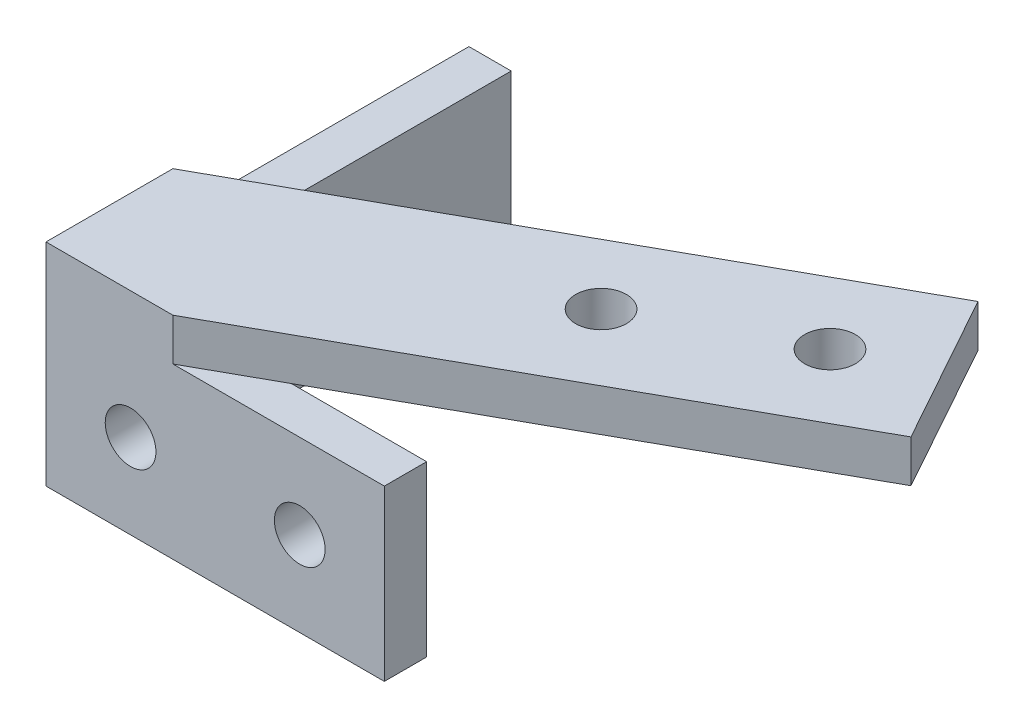
ISO-10303-21;
HEADER;
FILE_DESCRIPTION(('STEP AP214'),'2;1');
FILE_NAME('part.step','',(''),(''),'','','');
FILE_SCHEMA(('AUTOMOTIVE_DESIGN { 1 0 10303 214 1 1 1 1 }'));
ENDSEC;
DATA;
#1=APPLICATION_CONTEXT('core data for automotive mechanical design processes');
#2=APPLICATION_PROTOCOL_DEFINITION('international standard','automotive_design',2000,#1);
#3=PRODUCT_CONTEXT('',#1,'mechanical');
#4=PRODUCT('Part','Part','',(#3));
#5=PRODUCT_RELATED_PRODUCT_CATEGORY('part','',(#4));
#6=PRODUCT_DEFINITION_FORMATION('','',#4);
#7=PRODUCT_DEFINITION_CONTEXT('part definition',#1,'design');
#8=PRODUCT_DEFINITION('design','',#6,#7);
#9=PRODUCT_DEFINITION_SHAPE('','',#8);
#10=(LENGTH_UNIT() NAMED_UNIT(*) SI_UNIT(.MILLI.,.METRE.));
#11=(NAMED_UNIT(*) PLANE_ANGLE_UNIT() SI_UNIT($,.RADIAN.));
#12=(NAMED_UNIT(*) SI_UNIT($,.STERADIAN.) SOLID_ANGLE_UNIT());
#13=UNCERTAINTY_MEASURE_WITH_UNIT(LENGTH_MEASURE(1.E-05),#10,'distance_accuracy_value','');
#14=(GEOMETRIC_REPRESENTATION_CONTEXT(3) GLOBAL_UNCERTAINTY_ASSIGNED_CONTEXT((#13)) GLOBAL_UNIT_ASSIGNED_CONTEXT((#10,
#11,#12)) REPRESENTATION_CONTEXT('',''));
#15=CARTESIAN_POINT('',(0.,0.,0.));
#16=DIRECTION('',(0.,0.,1.));
#17=DIRECTION('',(1.,0.,0.));
#18=AXIS2_PLACEMENT_3D('',#15,#16,#17);
#19=CARTESIAN_POINT('',(0.,20.,0.));
#20=DIRECTION('',(0.,1.,0.));
#21=DIRECTION('',(0.,0.,1.));
#22=AXIS2_PLACEMENT_3D('',#19,#20,#21);
#23=PLANE('',#22);
#24=DIRECTION('',(-0.874157276113718,0.,0.485642931192707));
#25=VECTOR('',#24,1.);
#26=CARTESIAN_POINT('',(0.,20.,-15.));
#27=LINE('',#26,#25);
#28=CARTESIAN_POINT('',(5.,20.,-17.7777777778831));
#29=VERTEX_POINT('',#28);
#30=CARTESIAN_POINT('',(0.,20.,-15.));
#31=VERTEX_POINT('',#30);
#32=EDGE_CURVE('E11',#29,#31,#27,.T.);
#33=ORIENTED_EDGE('',*,*,#32,.F.);
#34=DIRECTION('',(0.,0.,-1.));
#35=VECTOR('',#34,1.);
#36=CARTESIAN_POINT('',(5.,20.,-5.));
#37=LINE('',#36,#35);
#38=CARTESIAN_POINT('',(5.,20.,-50.));
#39=VERTEX_POINT('',#38);
#40=EDGE_CURVE('E165',#29,#39,#37,.T.);
#41=ORIENTED_EDGE('',*,*,#40,.T.);
#42=DIRECTION('',(-1.,0.,0.));
#43=VECTOR('',#42,1.);
#44=CARTESIAN_POINT('',(5.,20.,-50.));
#45=LINE('',#44,#43);
#46=CARTESIAN_POINT('',(0.,20.,-50.));
#47=VERTEX_POINT('',#46);
#48=EDGE_CURVE('E153',#39,#47,#45,.T.);
#49=ORIENTED_EDGE('',*,*,#48,.T.);
#50=DIRECTION('',(0.,0.,1.));
#51=VECTOR('',#50,1.);
#52=CARTESIAN_POINT('',(0.,20.,-50.));
#53=LINE('',#52,#51);
#54=EDGE_CURVE('E156',#47,#31,#53,.T.);
#55=ORIENTED_EDGE('',*,*,#54,.T.);
#56=EDGE_LOOP('',(#33,#41,#49,#55));
#57=FACE_BOUND('',#56,.T.);
#58=ADVANCED_FACE('F37',(#57),#23,.T.);
#59=CARTESIAN_POINT('',(5.,20.,-50.));
#60=DIRECTION('',(0.,0.,1.));
#61=DIRECTION('',(1.,0.,0.));
#62=AXIS2_PLACEMENT_3D('',#59,#60,#61);
#63=PLANE('',#62);
#64=DIRECTION('',(-1.,0.,0.));
#65=VECTOR('',#64,1.);
#66=CARTESIAN_POINT('',(5.,0.,-50.));
#67=LINE('',#66,#65);
#68=CARTESIAN_POINT('',(5.,0.,-50.));
#69=VERTEX_POINT('',#68);
#70=CARTESIAN_POINT('',(0.,0.,-50.));
#71=VERTEX_POINT('',#70);
#72=EDGE_CURVE('E144',#69,#71,#67,.T.);
#73=ORIENTED_EDGE('',*,*,#72,.T.);
#74=DIRECTION('',(0.,-1.,0.));
#75=VECTOR('',#74,1.);
#76=CARTESIAN_POINT('',(0.,20.,-50.));
#77=LINE('',#76,#75);
#78=EDGE_CURVE('E46',#47,#71,#77,.T.);
#79=ORIENTED_EDGE('',*,*,#78,.F.);
#80=ORIENTED_EDGE('',*,*,#48,.F.);
#81=DIRECTION('',(0.,-1.,0.));
#82=VECTOR('',#81,1.);
#83=CARTESIAN_POINT('',(5.,20.,-50.));
#84=LINE('',#83,#82);
#85=EDGE_CURVE('E168',#39,#69,#84,.T.);
#86=ORIENTED_EDGE('',*,*,#85,.T.);
#87=EDGE_LOOP('',(#73,#79,#80,#86));
#88=FACE_BOUND('',#87,.T.);
#89=ADVANCED_FACE('F39',(#88),#63,.F.);
#90=CARTESIAN_POINT('',(0.,20.,-50.));
#91=DIRECTION('',(1.,0.,0.));
#92=DIRECTION('',(0.,0.,-1.));
#93=AXIS2_PLACEMENT_3D('',#90,#91,#92);
#94=PLANE('',#93);
#95=CARTESIAN_POINT('',(0.,10.,-15.));
#96=DIRECTION('',(1.,0.,0.));
#97=DIRECTION('',(0.,0.,-1.));
#98=AXIS2_PLACEMENT_3D('',#95,#96,#97);
#99=CIRCLE('',#98,3.);
#100=CARTESIAN_POINT('',(0.,10.,-18.));
#101=VERTEX_POINT('',#100);
#102=EDGE_CURVE('E207',#101,#101,#99,.T.);
#103=ORIENTED_EDGE('',*,*,#102,.T.);
#104=EDGE_LOOP('',(#103));
#105=FACE_BOUND('',#104,.T.);
#106=CARTESIAN_POINT('',(0.,10.,-35.));
#107=DIRECTION('',(1.,0.,0.));
#108=DIRECTION('',(0.,0.,-1.));
#109=AXIS2_PLACEMENT_3D('',#106,#107,#108);
#110=CIRCLE('',#109,2.99999999999999);
#111=CARTESIAN_POINT('',(0.,10.,-38.));
#112=VERTEX_POINT('',#111);
#113=EDGE_CURVE('E198',#112,#112,#110,.T.);
#114=ORIENTED_EDGE('',*,*,#113,.T.);
#115=EDGE_LOOP('',(#114));
#116=FACE_BOUND('',#115,.T.);
#117=DIRECTION('',(0.,0.,1.));
#118=VECTOR('',#117,1.);
#119=CARTESIAN_POINT('',(0.,0.,-50.));
#120=LINE('',#119,#118);
#121=CARTESIAN_POINT('',(0.,0.,0.));
#122=VERTEX_POINT('',#121);
#123=EDGE_CURVE('E147',#71,#122,#120,.T.);
#124=ORIENTED_EDGE('',*,*,#123,.T.);
#125=DIRECTION('',(0.,-1.,0.));
#126=VECTOR('',#125,1.);
#127=CARTESIAN_POINT('',(0.,20.,0.));
#128=LINE('',#127,#126);
#129=CARTESIAN_POINT('',(0.,25.,0.));
#130=VERTEX_POINT('',#129);
#131=EDGE_CURVE('E189',#130,#122,#128,.T.);
#132=ORIENTED_EDGE('',*,*,#131,.F.);
#133=DIRECTION('',(0.,0.,1.));
#134=VECTOR('',#133,1.);
#135=CARTESIAN_POINT('',(0.,25.,0.));
#136=LINE('',#135,#134);
#137=CARTESIAN_POINT('',(0.,25.,-15.));
#138=VERTEX_POINT('',#137);
#139=EDGE_CURVE('E137',#138,#130,#136,.T.);
#140=ORIENTED_EDGE('',*,*,#139,.F.);
#141=DIRECTION('',(0.,-1.,0.));
#142=VECTOR('',#141,1.);
#143=CARTESIAN_POINT('',(0.,25.,-15.));
#144=LINE('',#143,#142);
#145=EDGE_CURVE('E235',#138,#31,#144,.T.);
#146=ORIENTED_EDGE('',*,*,#145,.T.);
#147=ORIENTED_EDGE('',*,*,#54,.F.);
#148=ORIENTED_EDGE('',*,*,#78,.T.);
#149=EDGE_LOOP('',(#124,#132,#140,#146,#147,#148));
#150=FACE_BOUND('',#149,.T.);
#151=ADVANCED_FACE('F265',(#105,#116,#150),#94,.F.);
#152=CARTESIAN_POINT('',(0.,20.,0.));
#153=DIRECTION('',(0.,0.,-1.));
#154=DIRECTION('',(-1.,0.,0.));
#155=AXIS2_PLACEMENT_3D('',#152,#153,#154);
#156=PLANE('',#155);
#157=CARTESIAN_POINT('',(10.,10.,0.));
#158=DIRECTION('',(0.,0.,-1.));
#159=DIRECTION('',(-1.,0.,0.));
#160=AXIS2_PLACEMENT_3D('',#157,#158,#159);
#161=CIRCLE('',#160,3.);
#162=CARTESIAN_POINT('',(7.,10.,0.));
#163=VERTEX_POINT('',#162);
#164=EDGE_CURVE('E219',#163,#163,#161,.T.);
#165=ORIENTED_EDGE('',*,*,#164,.T.);
#166=EDGE_LOOP('',(#165));
#167=FACE_BOUND('',#166,.T.);
#168=CARTESIAN_POINT('',(30.,10.,0.));
#169=DIRECTION('',(0.,0.,-1.));
#170=DIRECTION('',(-1.,0.,0.));
#171=AXIS2_PLACEMENT_3D('',#168,#169,#170);
#172=CIRCLE('',#171,3.);
#173=CARTESIAN_POINT('',(27.,10.,0.));
#174=VERTEX_POINT('',#173);
#175=EDGE_CURVE('E210',#174,#174,#172,.T.);
#176=ORIENTED_EDGE('',*,*,#175,.T.);
#177=EDGE_LOOP('',(#176));
#178=FACE_BOUND('',#177,.T.);
#179=DIRECTION('',(1.,0.,0.));
#180=VECTOR('',#179,1.);
#181=CARTESIAN_POINT('',(0.,0.,0.));
#182=LINE('',#181,#180);
#183=CARTESIAN_POINT('',(40.,0.,0.));
#184=VERTEX_POINT('',#183);
#185=EDGE_CURVE('E171',#122,#184,#182,.T.);
#186=ORIENTED_EDGE('',*,*,#185,.T.);
#187=DIRECTION('',(0.,-1.,0.));
#188=VECTOR('',#187,1.);
#189=CARTESIAN_POINT('',(40.,20.,0.));
#190=LINE('',#189,#188);
#191=CARTESIAN_POINT('',(40.,20.,0.));
#192=VERTEX_POINT('',#191);
#193=EDGE_CURVE('E186',#192,#184,#190,.T.);
#194=ORIENTED_EDGE('',*,*,#193,.F.);
#195=DIRECTION('',(1.,0.,0.));
#196=VECTOR('',#195,1.);
#197=CARTESIAN_POINT('',(0.,20.,0.));
#198=LINE('',#197,#196);
#199=CARTESIAN_POINT('',(14.9999999999999,20.,0.));
#200=VERTEX_POINT('',#199);
#201=EDGE_CURVE('E143',#200,#192,#198,.T.);
#202=ORIENTED_EDGE('',*,*,#201,.F.);
#203=DIRECTION('',(0.,-1.,0.));
#204=VECTOR('',#203,1.);
#205=CARTESIAN_POINT('',(15.,25.,0.));
#206=LINE('',#205,#204);
#207=CARTESIAN_POINT('',(15.,25.,0.));
#208=VERTEX_POINT('',#207);
#209=EDGE_CURVE('E125',#208,#200,#206,.T.);
#210=ORIENTED_EDGE('',*,*,#209,.F.);
#211=DIRECTION('',(1.,0.,0.));
#212=VECTOR('',#211,1.);
#213=CARTESIAN_POINT('',(15.,25.,0.));
#214=LINE('',#213,#212);
#215=EDGE_CURVE('E131',#130,#208,#214,.T.);
#216=ORIENTED_EDGE('',*,*,#215,.F.);
#217=ORIENTED_EDGE('',*,*,#131,.T.);
#218=EDGE_LOOP('',(#186,#194,#202,#210,#216,#217));
#219=FACE_BOUND('',#218,.T.);
#220=ADVANCED_FACE('F141',(#167,#178,#219),#156,.F.);
#221=CARTESIAN_POINT('',(40.,20.,0.));
#222=DIRECTION('',(-1.,0.,0.));
#223=DIRECTION('',(0.,0.,1.));
#224=AXIS2_PLACEMENT_3D('',#221,#222,#223);
#225=PLANE('',#224);
#226=DIRECTION('',(0.,0.,-1.));
#227=VECTOR('',#226,1.);
#228=CARTESIAN_POINT('',(40.,0.,0.));
#229=LINE('',#228,#227);
#230=CARTESIAN_POINT('',(40.,0.,-5.));
#231=VERTEX_POINT('',#230);
#232=EDGE_CURVE('E173',#184,#231,#229,.T.);
#233=ORIENTED_EDGE('',*,*,#232,.T.);
#234=DIRECTION('',(0.,-1.,0.));
#235=VECTOR('',#234,1.);
#236=CARTESIAN_POINT('',(40.,20.,-5.));
#237=LINE('',#236,#235);
#238=CARTESIAN_POINT('',(40.,20.,-5.));
#239=VERTEX_POINT('',#238);
#240=EDGE_CURVE('E183',#239,#231,#237,.T.);
#241=ORIENTED_EDGE('',*,*,#240,.F.);
#242=DIRECTION('',(0.,0.,-1.));
#243=VECTOR('',#242,1.);
#244=CARTESIAN_POINT('',(40.,20.,0.));
#245=LINE('',#244,#243);
#246=EDGE_CURVE('E160',#192,#239,#245,.T.);
#247=ORIENTED_EDGE('',*,*,#246,.F.);
#248=ORIENTED_EDGE('',*,*,#193,.T.);
#249=EDGE_LOOP('',(#233,#241,#247,#248));
#250=FACE_BOUND('',#249,.T.);
#251=ADVANCED_FACE('F273',(#250),#225,.F.);
#252=CARTESIAN_POINT('',(40.,20.,-5.));
#253=DIRECTION('',(0.,0.,1.));
#254=DIRECTION('',(1.,0.,0.));
#255=AXIS2_PLACEMENT_3D('',#252,#253,#254);
#256=PLANE('',#255);
#257=CARTESIAN_POINT('',(10.,10.,-5.));
#258=DIRECTION('',(0.,0.,-1.));
#259=DIRECTION('',(-1.,0.,0.));
#260=AXIS2_PLACEMENT_3D('',#257,#258,#259);
#261=CIRCLE('',#260,3.);
#262=CARTESIAN_POINT('',(7.,10.,-5.));
#263=VERTEX_POINT('',#262);
#264=EDGE_CURVE('E223',#263,#263,#261,.T.);
#265=ORIENTED_EDGE('',*,*,#264,.F.);
#266=EDGE_LOOP('',(#265));
#267=FACE_BOUND('',#266,.T.);
#268=CARTESIAN_POINT('',(30.,10.,-5.));
#269=DIRECTION('',(0.,0.,-1.));
#270=DIRECTION('',(-1.,0.,0.));
#271=AXIS2_PLACEMENT_3D('',#268,#269,#270);
#272=CIRCLE('',#271,3.);
#273=CARTESIAN_POINT('',(27.,10.,-5.));
#274=VERTEX_POINT('',#273);
#275=EDGE_CURVE('E226',#274,#274,#272,.T.);
#276=ORIENTED_EDGE('',*,*,#275,.F.);
#277=EDGE_LOOP('',(#276));
#278=FACE_BOUND('',#277,.T.);
#279=DIRECTION('',(-1.,0.,0.));
#280=VECTOR('',#279,1.);
#281=CARTESIAN_POINT('',(40.,0.,-5.));
#282=LINE('',#281,#280);
#283=CARTESIAN_POINT('',(5.,0.,-5.));
#284=VERTEX_POINT('',#283);
#285=EDGE_CURVE('E175',#231,#284,#282,.T.);
#286=ORIENTED_EDGE('',*,*,#285,.T.);
#287=DIRECTION('',(0.,-1.,0.));
#288=VECTOR('',#287,1.);
#289=CARTESIAN_POINT('',(5.,20.,-5.));
#290=LINE('',#289,#288);
#291=CARTESIAN_POINT('',(5.,20.,-5.));
#292=VERTEX_POINT('',#291);
#293=EDGE_CURVE('E180',#292,#284,#290,.T.);
#294=ORIENTED_EDGE('',*,*,#293,.F.);
#295=DIRECTION('',(-1.,0.,0.));
#296=VECTOR('',#295,1.);
#297=CARTESIAN_POINT('',(40.,20.,-5.));
#298=LINE('',#297,#296);
#299=CARTESIAN_POINT('',(23.9999999996586,20.,-4.99999999999998));
#300=VERTEX_POINT('',#299);
#301=EDGE_CURVE('E162',#300,#292,#298,.T.);
#302=ORIENTED_EDGE('',*,*,#301,.F.);
#303=EDGE_CURVE('E163',#239,#300,#298,.T.);
#304=ORIENTED_EDGE('',*,*,#303,.F.);
#305=ORIENTED_EDGE('',*,*,#240,.T.);
#306=EDGE_LOOP('',(#286,#294,#302,#304,#305));
#307=FACE_BOUND('',#306,.T.);
#308=ADVANCED_FACE('F277',(#267,#278,#307),#256,.F.);
#309=CARTESIAN_POINT('',(5.,20.,-5.));
#310=DIRECTION('',(-1.,0.,0.));
#311=DIRECTION('',(0.,0.,1.));
#312=AXIS2_PLACEMENT_3D('',#309,#310,#311);
#313=PLANE('',#312);
#314=CARTESIAN_POINT('',(5.,10.,-15.));
#315=DIRECTION('',(1.,0.,0.));
#316=DIRECTION('',(0.,0.,-1.));
#317=AXIS2_PLACEMENT_3D('',#314,#315,#316);
#318=CIRCLE('',#317,3.);
#319=CARTESIAN_POINT('',(5.,10.,-18.));
#320=VERTEX_POINT('',#319);
#321=EDGE_CURVE('E211',#320,#320,#318,.T.);
#322=ORIENTED_EDGE('',*,*,#321,.F.);
#323=EDGE_LOOP('',(#322));
#324=FACE_BOUND('',#323,.T.);
#325=CARTESIAN_POINT('',(5.,10.,-35.));
#326=DIRECTION('',(1.,0.,0.));
#327=DIRECTION('',(0.,0.,-1.));
#328=AXIS2_PLACEMENT_3D('',#325,#326,#327);
#329=CIRCLE('',#328,2.99999999999999);
#330=CARTESIAN_POINT('',(5.,10.,-38.));
#331=VERTEX_POINT('',#330);
#332=EDGE_CURVE('E214',#331,#331,#329,.T.);
#333=ORIENTED_EDGE('',*,*,#332,.F.);
#334=EDGE_LOOP('',(#333));
#335=FACE_BOUND('',#334,.T.);
#336=DIRECTION('',(0.,0.,-1.));
#337=VECTOR('',#336,1.);
#338=CARTESIAN_POINT('',(5.,0.,-5.));
#339=LINE('',#338,#337);
#340=EDGE_CURVE('E157',#284,#69,#339,.T.);
#341=ORIENTED_EDGE('',*,*,#340,.T.);
#342=ORIENTED_EDGE('',*,*,#85,.F.);
#343=ORIENTED_EDGE('',*,*,#40,.F.);
#344=EDGE_CURVE('E166',#292,#29,#37,.T.);
#345=ORIENTED_EDGE('',*,*,#344,.F.);
#346=ORIENTED_EDGE('',*,*,#293,.T.);
#347=EDGE_LOOP('',(#341,#342,#343,#345,#346));
#348=FACE_BOUND('',#347,.T.);
#349=ADVANCED_FACE('F257',(#324,#335,#348),#313,.F.);
#350=DIRECTION('',(0.874157276113719,0.,-0.485642931192707));
#351=VECTOR('',#350,1.);
#352=CARTESIAN_POINT('',(71.0966697056514,20.,-31.1648165043217));
#353=LINE('',#352,#351);
#354=EDGE_CURVE('E61',#200,#300,#353,.T.);
#355=ORIENTED_EDGE('',*,*,#354,.F.);
#356=ORIENTED_EDGE('',*,*,#201,.T.);
#357=ORIENTED_EDGE('',*,*,#246,.T.);
#358=ORIENTED_EDGE('',*,*,#303,.T.);
#359=EDGE_LOOP('',(#355,#356,#357,#358));
#360=FACE_BOUND('',#359,.T.);
#361=ADVANCED_FACE('F278',(#360),#23,.T.);
#362=CARTESIAN_POINT('',(0.,0.,0.));
#363=DIRECTION('',(0.,1.,0.));
#364=DIRECTION('',(0.,0.,1.));
#365=AXIS2_PLACEMENT_3D('',#362,#363,#364);
#366=PLANE('',#365);
#367=ORIENTED_EDGE('',*,*,#72,.F.);
#368=ORIENTED_EDGE('',*,*,#340,.F.);
#369=ORIENTED_EDGE('',*,*,#285,.F.);
#370=ORIENTED_EDGE('',*,*,#232,.F.);
#371=ORIENTED_EDGE('',*,*,#185,.F.);
#372=ORIENTED_EDGE('',*,*,#123,.F.);
#373=EDGE_LOOP('',(#367,#368,#369,#370,#371,#372));
#374=FACE_BOUND('',#373,.T.);
#375=ADVANCED_FACE('F269',(#374),#366,.F.);
#376=CARTESIAN_POINT('',(71.0966697056514,25.,-31.1648165043217));
#377=DIRECTION('',(-0.485642931192707,0.,-0.874157276113719));
#378=DIRECTION('',(-0.874157276113719,0.,0.485642931192707));
#379=AXIS2_PLACEMENT_3D('',#376,#377,#378);
#380=PLANE('',#379);
#381=ORIENTED_EDGE('',*,*,#354,.T.);
#382=CARTESIAN_POINT('',(71.0966697056514,20.,-31.1648165043217));
#383=VERTEX_POINT('',#382);
#384=EDGE_CURVE('E222',#300,#383,#353,.T.);
#385=ORIENTED_EDGE('',*,*,#384,.T.);
#386=DIRECTION('',(0.,-1.,0.));
#387=VECTOR('',#386,1.);
#388=CARTESIAN_POINT('',(71.0966697056514,25.,-31.1648165043217));
#389=LINE('',#388,#387);
#390=CARTESIAN_POINT('',(71.0966697056514,25.,-31.1648165043217));
#391=VERTEX_POINT('',#390);
#392=EDGE_CURVE('E127',#391,#383,#389,.T.);
#393=ORIENTED_EDGE('',*,*,#392,.F.);
#394=DIRECTION('',(0.874157276113719,0.,-0.485642931192707));
#395=VECTOR('',#394,1.);
#396=CARTESIAN_POINT('',(71.0966697056514,25.,-31.1648165043217));
#397=LINE('',#396,#395);
#398=EDGE_CURVE('E121',#208,#391,#397,.T.);
#399=ORIENTED_EDGE('',*,*,#398,.F.);
#400=ORIENTED_EDGE('',*,*,#209,.T.);
#401=EDGE_LOOP('',(#381,#385,#393,#399,#400));
#402=FACE_BOUND('',#401,.T.);
#403=ADVANCED_FACE('F123',(#402),#380,.F.);
#404=CARTESIAN_POINT('',(61.1910093279603,25.,-48.9950051834895));
#405=DIRECTION('',(-0.874157276113718,0.,0.485642931192707));
#406=DIRECTION('',(0.485642931192707,0.,0.874157276113718));
#407=AXIS2_PLACEMENT_3D('',#404,#405,#406);
#408=PLANE('',#407);
#409=DIRECTION('',(-0.485642931192707,0.,-0.874157276113718));
#410=VECTOR('',#409,1.);
#411=CARTESIAN_POINT('',(61.1910093279603,20.,-48.9950051834895));
#412=LINE('',#411,#410);
#413=CARTESIAN_POINT('',(61.1910093279603,20.,-48.9950051834895));
#414=VERTEX_POINT('',#413);
#415=EDGE_CURVE('E237',#383,#414,#412,.T.);
#416=ORIENTED_EDGE('',*,*,#415,.T.);
#417=DIRECTION('',(0.,-1.,0.));
#418=VECTOR('',#417,1.);
#419=CARTESIAN_POINT('',(61.1910093279603,25.,-48.9950051834895));
#420=LINE('',#419,#418);
#421=CARTESIAN_POINT('',(61.1910093279603,25.,-48.9950051834895));
#422=VERTEX_POINT('',#421);
#423=EDGE_CURVE('E149',#422,#414,#420,.T.);
#424=ORIENTED_EDGE('',*,*,#423,.F.);
#425=DIRECTION('',(-0.485642931192707,0.,-0.874157276113718));
#426=VECTOR('',#425,1.);
#427=CARTESIAN_POINT('',(61.1910093279603,25.,-48.9950051834895));
#428=LINE('',#427,#426);
#429=EDGE_CURVE('E130',#391,#422,#428,.T.);
#430=ORIENTED_EDGE('',*,*,#429,.F.);
#431=ORIENTED_EDGE('',*,*,#392,.T.);
#432=EDGE_LOOP('',(#416,#424,#430,#431));
#433=FACE_BOUND('',#432,.T.);
#434=ADVANCED_FACE('F336',(#433),#408,.F.);
#435=CARTESIAN_POINT('',(0.,25.,-15.));
#436=DIRECTION('',(0.485642931192707,0.,0.874157276113718));
#437=DIRECTION('',(0.874157276113718,0.,-0.485642931192707));
#438=AXIS2_PLACEMENT_3D('',#435,#436,#437);
#439=PLANE('',#438);
#440=EDGE_CURVE('E48',#414,#29,#27,.T.);
#441=ORIENTED_EDGE('',*,*,#440,.T.);
#442=ORIENTED_EDGE('',*,*,#32,.T.);
#443=ORIENTED_EDGE('',*,*,#145,.F.);
#444=DIRECTION('',(-0.874157276113718,0.,0.485642931192707));
#445=VECTOR('',#444,1.);
#446=CARTESIAN_POINT('',(0.,25.,-15.));
#447=LINE('',#446,#445);
#448=EDGE_CURVE('E232',#422,#138,#447,.T.);
#449=ORIENTED_EDGE('',*,*,#448,.F.);
#450=ORIENTED_EDGE('',*,*,#423,.T.);
#451=EDGE_LOOP('',(#441,#442,#443,#449,#450));
#452=FACE_BOUND('',#451,.T.);
#453=ADVANCED_FACE('F246',(#452),#439,.F.);
#454=CARTESIAN_POINT('',(0.,25.,0.));
#455=DIRECTION('',(0.,-1.,0.));
#456=DIRECTION('',(0.,0.,-1.));
#457=AXIS2_PLACEMENT_3D('',#454,#455,#456);
#458=PLANE('',#457);
#459=CARTESIAN_POINT('',(57.3236413142359,25.,-35.3650073265521));
#460=DIRECTION('',(0.,1.,0.));
#461=DIRECTION('',(0.,0.,1.));
#462=AXIS2_PLACEMENT_3D('',#459,#460,#461);
#463=CIRCLE('',#462,3.00000000000001);
#464=CARTESIAN_POINT('',(57.3236413142359,25.,-32.3650073265521));
#465=VERTEX_POINT('',#464);
#466=EDGE_CURVE('E194',#465,#465,#463,.T.);
#467=ORIENTED_EDGE('',*,*,#466,.F.);
#468=EDGE_LOOP('',(#467));
#469=FACE_BOUND('',#468,.T.);
#470=CARTESIAN_POINT('',(39.6855563618901,25.,-25.9364358963813));
#471=DIRECTION('',(0.,1.,0.));
#472=DIRECTION('',(0.,0.,1.));
#473=AXIS2_PLACEMENT_3D('',#470,#471,#472);
#474=CIRCLE('',#473,3.);
#475=CARTESIAN_POINT('',(39.6855563618901,25.,-22.9364358963813));
#476=VERTEX_POINT('',#475);
#477=EDGE_CURVE('E200',#476,#476,#474,.T.);
#478=ORIENTED_EDGE('',*,*,#477,.F.);
#479=EDGE_LOOP('',(#478));
#480=FACE_BOUND('',#479,.T.);
#481=ORIENTED_EDGE('',*,*,#215,.T.);
#482=ORIENTED_EDGE('',*,*,#398,.T.);
#483=ORIENTED_EDGE('',*,*,#429,.T.);
#484=ORIENTED_EDGE('',*,*,#448,.T.);
#485=ORIENTED_EDGE('',*,*,#139,.T.);
#486=EDGE_LOOP('',(#481,#482,#483,#484,#485));
#487=FACE_BOUND('',#486,.T.);
#488=ADVANCED_FACE('F135',(#469,#480,#487),#458,.F.);
#489=CARTESIAN_POINT('',(0.,20.,0.));
#490=DIRECTION('',(0.,-1.,0.));
#491=DIRECTION('',(0.,0.,-1.));
#492=AXIS2_PLACEMENT_3D('',#489,#490,#491);
#493=PLANE('',#492);
#494=CARTESIAN_POINT('',(57.3236413142359,20.,-35.3650073265521));
#495=DIRECTION('',(0.,-1.,0.));
#496=DIRECTION('',(0.,0.,-1.));
#497=AXIS2_PLACEMENT_3D('',#494,#495,#496);
#498=CIRCLE('',#497,3.00000000000001);
#499=CARTESIAN_POINT('',(57.3236413142359,20.,-38.3650073265521));
#500=VERTEX_POINT('',#499);
#501=EDGE_CURVE('E41',#500,#500,#498,.T.);
#502=ORIENTED_EDGE('',*,*,#501,.F.);
#503=EDGE_LOOP('',(#502));
#504=FACE_BOUND('',#503,.T.);
#505=CARTESIAN_POINT('',(39.6855563618901,20.,-25.9364358963813));
#506=DIRECTION('',(0.,-1.,0.));
#507=DIRECTION('',(0.,0.,-1.));
#508=AXIS2_PLACEMENT_3D('',#505,#506,#507);
#509=CIRCLE('',#508,3.);
#510=CARTESIAN_POINT('',(39.6855563618901,20.,-28.9364358963813));
#511=VERTEX_POINT('',#510);
#512=EDGE_CURVE('E192',#511,#511,#509,.T.);
#513=ORIENTED_EDGE('',*,*,#512,.F.);
#514=EDGE_LOOP('',(#513));
#515=FACE_BOUND('',#514,.T.);
#516=ORIENTED_EDGE('',*,*,#384,.F.);
#517=ORIENTED_EDGE('',*,*,#301,.T.);
#518=ORIENTED_EDGE('',*,*,#344,.T.);
#519=ORIENTED_EDGE('',*,*,#440,.F.);
#520=ORIENTED_EDGE('',*,*,#415,.F.);
#521=EDGE_LOOP('',(#516,#517,#518,#519,#520));
#522=FACE_BOUND('',#521,.T.);
#523=ADVANCED_FACE('F252',(#504,#515,#522),#493,.T.);
#524=CARTESIAN_POINT('',(30.,10.,0.));
#525=DIRECTION('',(0.,0.,-1.));
#526=DIRECTION('',(-1.,0.,0.));
#527=AXIS2_PLACEMENT_3D('',#524,#525,#526);
#528=CYLINDRICAL_SURFACE('',#527,3.);
#529=ORIENTED_EDGE('',*,*,#175,.F.);
#530=EDGE_LOOP('',(#529));
#531=FACE_BOUND('',#530,.T.);
#532=ORIENTED_EDGE('',*,*,#275,.T.);
#533=EDGE_LOOP('',(#532));
#534=FACE_BOUND('',#533,.T.);
#535=ADVANCED_FACE('F314',(#531,#534),#528,.F.);
#536=CARTESIAN_POINT('',(10.,10.,0.));
#537=DIRECTION('',(0.,0.,-1.));
#538=DIRECTION('',(-1.,0.,0.));
#539=AXIS2_PLACEMENT_3D('',#536,#537,#538);
#540=CYLINDRICAL_SURFACE('',#539,3.);
#541=ORIENTED_EDGE('',*,*,#164,.F.);
#542=EDGE_LOOP('',(#541));
#543=FACE_BOUND('',#542,.T.);
#544=ORIENTED_EDGE('',*,*,#264,.T.);
#545=EDGE_LOOP('',(#544));
#546=FACE_BOUND('',#545,.T.);
#547=ADVANCED_FACE('F316',(#543,#546),#540,.F.);
#548=CARTESIAN_POINT('',(0.,10.,-35.));
#549=DIRECTION('',(1.,0.,0.));
#550=DIRECTION('',(0.,0.,-1.));
#551=AXIS2_PLACEMENT_3D('',#548,#549,#550);
#552=CYLINDRICAL_SURFACE('',#551,2.99999999999999);
#553=ORIENTED_EDGE('',*,*,#113,.F.);
#554=EDGE_LOOP('',(#553));
#555=FACE_BOUND('',#554,.T.);
#556=ORIENTED_EDGE('',*,*,#332,.T.);
#557=EDGE_LOOP('',(#556));
#558=FACE_BOUND('',#557,.T.);
#559=ADVANCED_FACE('F323',(#555,#558),#552,.F.);
#560=CARTESIAN_POINT('',(0.,10.,-15.));
#561=DIRECTION('',(1.,0.,0.));
#562=DIRECTION('',(0.,0.,-1.));
#563=AXIS2_PLACEMENT_3D('',#560,#561,#562);
#564=CYLINDRICAL_SURFACE('',#563,3.);
#565=ORIENTED_EDGE('',*,*,#102,.F.);
#566=EDGE_LOOP('',(#565));
#567=FACE_BOUND('',#566,.T.);
#568=ORIENTED_EDGE('',*,*,#321,.T.);
#569=EDGE_LOOP('',(#568));
#570=FACE_BOUND('',#569,.T.);
#571=ADVANCED_FACE('F374',(#567,#570),#564,.F.);
#572=CARTESIAN_POINT('',(39.6855563618901,0.,-25.9364358963813));
#573=DIRECTION('',(0.,1.,0.));
#574=DIRECTION('',(0.,0.,1.));
#575=AXIS2_PLACEMENT_3D('',#572,#573,#574);
#576=CYLINDRICAL_SURFACE('',#575,3.);
#577=ORIENTED_EDGE('',*,*,#512,.T.);
#578=EDGE_LOOP('',(#577));
#579=FACE_BOUND('',#578,.T.);
#580=ORIENTED_EDGE('',*,*,#477,.T.);
#581=EDGE_LOOP('',(#580));
#582=FACE_BOUND('',#581,.T.);
#583=ADVANCED_FACE('F368',(#579,#582),#576,.F.);
#584=CARTESIAN_POINT('',(57.3236413142359,0.,-35.3650073265521));
#585=DIRECTION('',(0.,1.,0.));
#586=DIRECTION('',(0.,0.,1.));
#587=AXIS2_PLACEMENT_3D('',#584,#585,#586);
#588=CYLINDRICAL_SURFACE('',#587,3.00000000000001);
#589=ORIENTED_EDGE('',*,*,#501,.T.);
#590=EDGE_LOOP('',(#589));
#591=FACE_BOUND('',#590,.T.);
#592=ORIENTED_EDGE('',*,*,#466,.T.);
#593=EDGE_LOOP('',(#592));
#594=FACE_BOUND('',#593,.T.);
#595=ADVANCED_FACE('F373',(#591,#594),#588,.F.);
#596=CLOSED_SHELL('',(#58,#89,#151,#220,#251,#308,#349,#361,#375,#403,#434,#453,#488,#523,#535,
#547,#559,#571,#583,#595));
#597=MANIFOLD_SOLID_BREP('B2',#596);
#598=ADVANCED_BREP_SHAPE_REPRESENTATION('',(#18,#597),#14);
#599=SHAPE_DEFINITION_REPRESENTATION(#9,#598);
ENDSEC;
END-ISO-10303-21;
